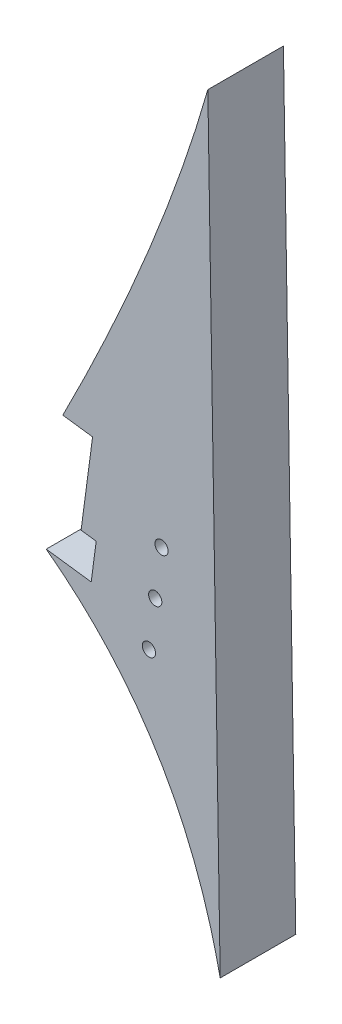
ISO-10303-21;
HEADER;
FILE_DESCRIPTION(('STEP AP214'),'2;1');
FILE_NAME('part.step','',(''),(''),'','','');
FILE_SCHEMA(('AUTOMOTIVE_DESIGN { 1 0 10303 214 1 1 1 1 }'));
ENDSEC;
DATA;
#1=APPLICATION_CONTEXT('core data for automotive mechanical design processes');
#2=APPLICATION_PROTOCOL_DEFINITION('international standard','automotive_design',2000,#1);
#3=PRODUCT_CONTEXT('',#1,'mechanical');
#4=PRODUCT('Part','Part','',(#3));
#5=PRODUCT_RELATED_PRODUCT_CATEGORY('part','',(#4));
#6=PRODUCT_DEFINITION_FORMATION('','',#4);
#7=PRODUCT_DEFINITION_CONTEXT('part definition',#1,'design');
#8=PRODUCT_DEFINITION('design','',#6,#7);
#9=PRODUCT_DEFINITION_SHAPE('','',#8);
#10=(LENGTH_UNIT() NAMED_UNIT(*) SI_UNIT(.MILLI.,.METRE.));
#11=(NAMED_UNIT(*) PLANE_ANGLE_UNIT() SI_UNIT($,.RADIAN.));
#12=(NAMED_UNIT(*) SI_UNIT($,.STERADIAN.) SOLID_ANGLE_UNIT());
#13=UNCERTAINTY_MEASURE_WITH_UNIT(LENGTH_MEASURE(1.E-05),#10,'distance_accuracy_value','');
#14=(GEOMETRIC_REPRESENTATION_CONTEXT(3) GLOBAL_UNCERTAINTY_ASSIGNED_CONTEXT((#13)) GLOBAL_UNIT_ASSIGNED_CONTEXT((#10,
#11,#12)) REPRESENTATION_CONTEXT('',''));
#15=CARTESIAN_POINT('',(0.,0.,0.));
#16=DIRECTION('',(0.,0.,1.));
#17=DIRECTION('',(1.,0.,0.));
#18=AXIS2_PLACEMENT_3D('',#15,#16,#17);
#19=CARTESIAN_POINT('',(273.434767302731,-422.936084160786,20.));
#20=DIRECTION('',(0.131604534920493,0.991302298185756,0.));
#21=DIRECTION('',(-0.991302298185756,0.131604534920493,0.));
#22=AXIS2_PLACEMENT_3D('',#19,#20,#21);
#23=PLANE('',#22);
#24=DIRECTION('',(0.991302298185755,-0.131604534920493,0.));
#25=VECTOR('',#24,1.);
#26=CARTESIAN_POINT('',(273.434767302731,-422.936084160786,0.));
#27=LINE('',#26,#25);
#28=CARTESIAN_POINT('',(265.552888050043,-421.889691899568,0.));
#29=VERTEX_POINT('',#28);
#30=CARTESIAN_POINT('',(273.434767302731,-422.936084160786,0.));
#31=VERTEX_POINT('',#30);
#32=EDGE_CURVE('E135',#29,#31,#27,.T.);
#33=ORIENTED_EDGE('',*,*,#32,.T.);
#34=DIRECTION('',(0.,0.,-1.));
#35=VECTOR('',#34,1.);
#36=CARTESIAN_POINT('',(273.434767302731,-422.936084160786,20.));
#37=LINE('',#36,#35);
#38=CARTESIAN_POINT('',(273.434767302731,-422.936084160786,20.));
#39=VERTEX_POINT('',#38);
#40=EDGE_CURVE('E11',#39,#31,#37,.T.);
#41=ORIENTED_EDGE('',*,*,#40,.F.);
#42=DIRECTION('',(0.991302298185755,-0.131604534920493,0.));
#43=VECTOR('',#42,1.);
#44=CARTESIAN_POINT('',(273.434767302731,-422.936084160786,20.));
#45=LINE('',#44,#43);
#46=CARTESIAN_POINT('',(265.552888050043,-421.889691899568,20.));
#47=VERTEX_POINT('',#46);
#48=EDGE_CURVE('E199',#47,#39,#45,.T.);
#49=ORIENTED_EDGE('',*,*,#48,.F.);
#50=DIRECTION('',(0.,0.,-1.));
#51=VECTOR('',#50,1.);
#52=CARTESIAN_POINT('',(265.552888050043,-421.889691899568,20.));
#53=LINE('',#52,#51);
#54=EDGE_CURVE('E125',#47,#29,#53,.T.);
#55=ORIENTED_EDGE('',*,*,#54,.T.);
#56=EDGE_LOOP('',(#33,#41,#49,#55));
#57=FACE_BOUND('',#56,.T.);
#58=ADVANCED_FACE('F33',(#57),#23,.F.);
#59=CARTESIAN_POINT('',(273.434767302731,-422.936084160786,20.));
#60=DIRECTION('',(0.991302298185739,-0.131604534920616,0.));
#61=DIRECTION('',(0.131604534920616,0.991302298185739,0.));
#62=AXIS2_PLACEMENT_3D('',#59,#60,#61);
#63=PLANE('',#62);
#64=DIRECTION('',(-0.131604534920616,-0.991302298185739,0.));
#65=VECTOR('',#64,1.);
#66=CARTESIAN_POINT('',(273.434767302731,-422.936084160786,0.));
#67=LINE('',#66,#65);
#68=CARTESIAN_POINT('',(270.394702546065,-445.835167248877,0.));
#69=VERTEX_POINT('',#68);
#70=EDGE_CURVE('E168',#31,#69,#67,.T.);
#71=ORIENTED_EDGE('',*,*,#70,.T.);
#72=DIRECTION('',(0.,0.,-1.));
#73=VECTOR('',#72,1.);
#74=CARTESIAN_POINT('',(270.394702546065,-445.835167248877,20.));
#75=LINE('',#74,#73);
#76=CARTESIAN_POINT('',(270.394702546065,-445.835167248877,20.));
#77=VERTEX_POINT('',#76);
#78=EDGE_CURVE('E41',#77,#69,#75,.T.);
#79=ORIENTED_EDGE('',*,*,#78,.F.);
#80=DIRECTION('',(-0.131604534920616,-0.991302298185739,0.));
#81=VECTOR('',#80,1.);
#82=CARTESIAN_POINT('',(273.434767302731,-422.936084160786,20.));
#83=LINE('',#82,#81);
#84=EDGE_CURVE('E91',#39,#77,#83,.T.);
#85=ORIENTED_EDGE('',*,*,#84,.F.);
#86=ORIENTED_EDGE('',*,*,#40,.T.);
#87=EDGE_LOOP('',(#71,#79,#85,#86));
#88=FACE_BOUND('',#87,.T.);
#89=ADVANCED_FACE('F161',(#88),#63,.F.);
#90=CARTESIAN_POINT('',(270.394702546065,-445.835167248877,20.));
#91=DIRECTION('',(0.131604534920474,0.991302298185758,0.));
#92=DIRECTION('',(-0.991302298185758,0.131604534920474,0.));
#93=AXIS2_PLACEMENT_3D('',#90,#91,#92);
#94=PLANE('',#93);
#95=DIRECTION('',(0.991302298185758,-0.131604534920474,0.));
#96=VECTOR('',#95,1.);
#97=CARTESIAN_POINT('',(270.394702546065,-445.835167248877,0.));
#98=LINE('',#97,#96);
#99=CARTESIAN_POINT('',(274.394702546067,-446.366204189521,0.));
#100=VERTEX_POINT('',#99);
#101=EDGE_CURVE('E176',#69,#100,#98,.T.);
#102=ORIENTED_EDGE('',*,*,#101,.T.);
#103=DIRECTION('',(0.,0.,-1.));
#104=VECTOR('',#103,1.);
#105=CARTESIAN_POINT('',(274.394702546067,-446.366204189521,20.));
#106=LINE('',#105,#104);
#107=CARTESIAN_POINT('',(274.394702546067,-446.366204189521,20.));
#108=VERTEX_POINT('',#107);
#109=EDGE_CURVE('E180',#108,#100,#106,.T.);
#110=ORIENTED_EDGE('',*,*,#109,.F.);
#111=DIRECTION('',(0.991302298185758,-0.131604534920474,0.));
#112=VECTOR('',#111,1.);
#113=CARTESIAN_POINT('',(270.394702546065,-445.835167248877,20.));
#114=LINE('',#113,#112);
#115=EDGE_CURVE('E179',#77,#108,#114,.T.);
#116=ORIENTED_EDGE('',*,*,#115,.F.);
#117=ORIENTED_EDGE('',*,*,#78,.T.);
#118=EDGE_LOOP('',(#102,#110,#116,#117));
#119=FACE_BOUND('',#118,.T.);
#120=ADVANCED_FACE('F158',(#119),#94,.F.);
#121=CARTESIAN_POINT('',(274.394702546067,-446.366204189521,20.));
#122=DIRECTION('',(0.991302298185756,-0.131604534920488,0.));
#123=DIRECTION('',(0.131604534920488,0.991302298185756,0.));
#124=AXIS2_PLACEMENT_3D('',#121,#122,#123);
#125=PLANE('',#124);
#126=DIRECTION('',(-0.131604534920488,-0.991302298185756,0.));
#127=VECTOR('',#126,1.);
#128=CARTESIAN_POINT('',(274.394702546067,-446.366204189521,0.));
#129=LINE('',#128,#127);
#130=CARTESIAN_POINT('',(273.067110194457,-456.366204189521,0.));
#131=VERTEX_POINT('',#130);
#132=EDGE_CURVE('E183',#100,#131,#129,.T.);
#133=ORIENTED_EDGE('',*,*,#132,.T.);
#134=DIRECTION('',(0.,0.,-1.));
#135=VECTOR('',#134,1.);
#136=CARTESIAN_POINT('',(273.067110194457,-456.366204189521,20.));
#137=LINE('',#136,#135);
#138=CARTESIAN_POINT('',(273.067110194457,-456.366204189521,20.));
#139=VERTEX_POINT('',#138);
#140=EDGE_CURVE('E206',#139,#131,#137,.T.);
#141=ORIENTED_EDGE('',*,*,#140,.F.);
#142=DIRECTION('',(-0.131604534920488,-0.991302298185756,0.));
#143=VECTOR('',#142,1.);
#144=CARTESIAN_POINT('',(274.394702546067,-446.366204189521,20.));
#145=LINE('',#144,#143);
#146=EDGE_CURVE('E211',#108,#139,#145,.T.);
#147=ORIENTED_EDGE('',*,*,#146,.F.);
#148=ORIENTED_EDGE('',*,*,#109,.T.);
#149=EDGE_LOOP('',(#133,#141,#147,#148));
#150=FACE_BOUND('',#149,.T.);
#151=ADVANCED_FACE('F154',(#150),#125,.F.);
#152=CARTESIAN_POINT('',(273.067110194457,-456.366204189521,20.));
#153=DIRECTION('',(-0.131604534920499,-0.991302298185755,0.));
#154=DIRECTION('',(0.991302298185755,-0.131604534920499,0.));
#155=AXIS2_PLACEMENT_3D('',#152,#153,#154);
#156=PLANE('',#155);
#157=DIRECTION('',(-0.991302298185755,0.131604534920499,0.));
#158=VECTOR('',#157,1.);
#159=CARTESIAN_POINT('',(273.067110194457,-456.366204189521,0.));
#160=LINE('',#159,#158);
#161=CARTESIAN_POINT('',(261.171482616228,-454.786949770475,0.));
#162=VERTEX_POINT('',#161);
#163=EDGE_CURVE('E185',#131,#162,#160,.T.);
#164=ORIENTED_EDGE('',*,*,#163,.T.);
#165=DIRECTION('',(0.,0.,-1.));
#166=VECTOR('',#165,1.);
#167=CARTESIAN_POINT('',(261.171482616228,-454.786949770475,20.));
#168=LINE('',#167,#166);
#169=CARTESIAN_POINT('',(261.171482616228,-454.786949770475,20.));
#170=VERTEX_POINT('',#169);
#171=EDGE_CURVE('E120',#170,#162,#168,.T.);
#172=ORIENTED_EDGE('',*,*,#171,.F.);
#173=DIRECTION('',(-0.991302298185755,0.131604534920499,0.));
#174=VECTOR('',#173,1.);
#175=CARTESIAN_POINT('',(273.067110194457,-456.366204189521,20.));
#176=LINE('',#175,#174);
#177=EDGE_CURVE('E110',#139,#170,#176,.T.);
#178=ORIENTED_EDGE('',*,*,#177,.F.);
#179=ORIENTED_EDGE('',*,*,#140,.T.);
#180=EDGE_LOOP('',(#164,#172,#178,#179));
#181=FACE_BOUND('',#180,.T.);
#182=ADVANCED_FACE('F151',(#181),#156,.F.);
#183=CARTESIAN_POINT('',(261.171482616228,-454.786949770475,20.));
#184=CARTESIAN_POINT('',(296.963881997729,-481.467411972177,20.));
#185=CARTESIAN_POINT('',(307.211379583994,-530.076645966641,20.));
#186=B_SPLINE_CURVE_WITH_KNOTS('',2,(#183,#184,#185),.UNSPECIFIED.,.F.,.F.,(3,3),(0.,1.),.UNSPECIFIED.);
#187=DIRECTION('',(0.,0.,-1.));
#188=VECTOR('',#187,1.);
#189=SURFACE_OF_LINEAR_EXTRUSION('',#186,#188);
#190=CARTESIAN_POINT('',(261.171482616228,-454.786949770475,0.));
#191=CARTESIAN_POINT('',(296.963881997729,-481.467411972177,0.));
#192=CARTESIAN_POINT('',(307.211379583994,-530.076645966641,0.));
#193=B_SPLINE_CURVE_WITH_KNOTS('',2,(#190,#191,#192),.UNSPECIFIED.,.F.,.F.,(3,3),(0.,1.),.UNSPECIFIED.);
#194=CARTESIAN_POINT('',(307.211379583994,-530.076645966641,0.));
#195=VERTEX_POINT('',#194);
#196=EDGE_CURVE('E119',#162,#195,#193,.T.);
#197=ORIENTED_EDGE('',*,*,#196,.T.);
#198=DIRECTION('',(0.,0.,-1.));
#199=VECTOR('',#198,1.);
#200=CARTESIAN_POINT('',(307.211379583994,-530.076645966641,20.));
#201=LINE('',#200,#199);
#202=CARTESIAN_POINT('',(307.211379583994,-530.076645966641,20.));
#203=VERTEX_POINT('',#202);
#204=EDGE_CURVE('E116',#203,#195,#201,.T.);
#205=ORIENTED_EDGE('',*,*,#204,.F.);
#206=EDGE_CURVE('E104',#170,#203,#186,.T.);
#207=ORIENTED_EDGE('',*,*,#206,.F.);
#208=ORIENTED_EDGE('',*,*,#171,.T.);
#209=EDGE_LOOP('',(#197,#205,#207,#208));
#210=FACE_BOUND('',#209,.T.);
#211=ADVANCED_FACE('F117',(#210),#189,.F.);
#212=CARTESIAN_POINT('',(304.794080931401,-380.481047826027,20.));
#213=DIRECTION('',(-0.999869470715799,-0.0161567797072358,0.));
#214=DIRECTION('',(0.0161567797072358,-0.999869470715799,0.));
#215=AXIS2_PLACEMENT_3D('',#212,#213,#214);
#216=PLANE('',#215);
#217=DIRECTION('',(-0.0161567797072358,0.999869470715799,0.));
#218=VECTOR('',#217,1.);
#219=CARTESIAN_POINT('',(304.794080931401,-380.481047826027,0.));
#220=LINE('',#219,#218);
#221=CARTESIAN_POINT('',(303.947271008408,-328.075840548202,0.));
#222=VERTEX_POINT('',#221);
#223=EDGE_CURVE('E77',#195,#222,#220,.T.);
#224=ORIENTED_EDGE('',*,*,#223,.T.);
#225=DIRECTION('',(0.,0.,-1.));
#226=VECTOR('',#225,1.);
#227=CARTESIAN_POINT('',(303.947271008408,-328.075840548202,20.));
#228=LINE('',#227,#226);
#229=CARTESIAN_POINT('',(303.947271008408,-328.075840548202,20.));
#230=VERTEX_POINT('',#229);
#231=EDGE_CURVE('E121',#230,#222,#228,.T.);
#232=ORIENTED_EDGE('',*,*,#231,.F.);
#233=DIRECTION('',(-0.0161567797072361,0.999869470715799,0.));
#234=VECTOR('',#233,1.);
#235=CARTESIAN_POINT('',(306.5276142249,-487.76152376536,20.));
#236=LINE('',#235,#234);
#237=EDGE_CURVE('E108',#203,#230,#236,.T.);
#238=ORIENTED_EDGE('',*,*,#237,.F.);
#239=ORIENTED_EDGE('',*,*,#204,.T.);
#240=EDGE_LOOP('',(#224,#232,#238,#239));
#241=FACE_BOUND('',#240,.T.);
#242=ADVANCED_FACE('F123',(#241),#216,.F.);
#243=CARTESIAN_POINT('',(303.947271008408,-328.075840548202,20.));
#244=CARTESIAN_POINT('',(291.93823328982,-370.199418031665,20.));
#245=CARTESIAN_POINT('',(265.552888050043,-421.889691899568,20.));
#246=B_SPLINE_CURVE_WITH_KNOTS('',2,(#243,#244,#245),.UNSPECIFIED.,.F.,.F.,(3,3),(0.,1.),.UNSPECIFIED.);
#247=DIRECTION('',(0.,0.,-1.));
#248=VECTOR('',#247,1.);
#249=SURFACE_OF_LINEAR_EXTRUSION('',#246,#248);
#250=CARTESIAN_POINT('',(303.947271008408,-328.075840548202,0.));
#251=CARTESIAN_POINT('',(291.93823328982,-370.199418031665,0.));
#252=CARTESIAN_POINT('',(265.552888050043,-421.889691899568,0.));
#253=B_SPLINE_CURVE_WITH_KNOTS('',2,(#250,#251,#252),.UNSPECIFIED.,.F.,.F.,(3,3),(0.,1.),.UNSPECIFIED.);
#254=EDGE_CURVE('E83',#222,#29,#253,.T.);
#255=ORIENTED_EDGE('',*,*,#254,.T.);
#256=ORIENTED_EDGE('',*,*,#54,.F.);
#257=EDGE_CURVE('E49',#230,#47,#246,.T.);
#258=ORIENTED_EDGE('',*,*,#257,.F.);
#259=ORIENTED_EDGE('',*,*,#231,.T.);
#260=EDGE_LOOP('',(#255,#256,#258,#259));
#261=FACE_BOUND('',#260,.T.);
#262=ADVANCED_FACE('F141',(#261),#249,.F.);
#263=CARTESIAN_POINT('',(288.344156409523,-372.591092127775,20.));
#264=DIRECTION('',(0.,0.,1.));
#265=DIRECTION('',(1.,0.,0.));
#266=AXIS2_PLACEMENT_3D('',#263,#264,#265);
#267=PLANE('',#266);
#268=CARTESIAN_POINT('',(288.352935211609,-464.179893051408,20.));
#269=DIRECTION('',(0.,0.,1.));
#270=DIRECTION('',(1.,0.,0.));
#271=AXIS2_PLACEMENT_3D('',#268,#269,#270);
#272=CIRCLE('',#271,1.74999999999998);
#273=CARTESIAN_POINT('',(290.102935211609,-464.179893051408,20.));
#274=VERTEX_POINT('',#273);
#275=EDGE_CURVE('E229',#274,#274,#272,.T.);
#276=ORIENTED_EDGE('',*,*,#275,.F.);
#277=EDGE_LOOP('',(#276));
#278=FACE_BOUND('',#277,.T.);
#279=CARTESIAN_POINT('',(290.016681940702,-451.647832836733,20.));
#280=DIRECTION('',(0.,0.,1.));
#281=DIRECTION('',(1.,0.,0.));
#282=AXIS2_PLACEMENT_3D('',#279,#280,#281);
#283=CIRCLE('',#282,1.74999999999998);
#284=CARTESIAN_POINT('',(291.766681940702,-451.647832836733,20.));
#285=VERTEX_POINT('',#284);
#286=EDGE_CURVE('E223',#285,#285,#283,.T.);
#287=ORIENTED_EDGE('',*,*,#286,.F.);
#288=EDGE_LOOP('',(#287));
#289=FACE_BOUND('',#288,.T.);
#290=CARTESIAN_POINT('',(291.680428669797,-439.115772622058,20.));
#291=DIRECTION('',(0.,0.,1.));
#292=DIRECTION('',(1.,0.,0.));
#293=AXIS2_PLACEMENT_3D('',#290,#291,#292);
#294=CIRCLE('',#293,1.74999999999777);
#295=CARTESIAN_POINT('',(293.430428669794,-439.115772622058,20.));
#296=VERTEX_POINT('',#295);
#297=EDGE_CURVE('E217',#296,#296,#294,.T.);
#298=ORIENTED_EDGE('',*,*,#297,.F.);
#299=EDGE_LOOP('',(#298));
#300=FACE_BOUND('',#299,.T.);
#301=ORIENTED_EDGE('',*,*,#48,.T.);
#302=ORIENTED_EDGE('',*,*,#84,.T.);
#303=ORIENTED_EDGE('',*,*,#115,.T.);
#304=ORIENTED_EDGE('',*,*,#146,.T.);
#305=ORIENTED_EDGE('',*,*,#177,.T.);
#306=ORIENTED_EDGE('',*,*,#206,.T.);
#307=ORIENTED_EDGE('',*,*,#237,.T.);
#308=ORIENTED_EDGE('',*,*,#257,.T.);
#309=EDGE_LOOP('',(#301,#302,#303,#304,#305,#306,#307,#308));
#310=FACE_BOUND('',#309,.T.);
#311=ADVANCED_FACE('F106',(#278,#289,#300,#310),#267,.T.);
#312=CARTESIAN_POINT('',(288.344156409523,-372.591092127775,0.));
#313=DIRECTION('',(0.,0.,1.));
#314=DIRECTION('',(1.,0.,0.));
#315=AXIS2_PLACEMENT_3D('',#312,#313,#314);
#316=PLANE('',#315);
#317=CARTESIAN_POINT('',(288.352935211609,-464.179893051408,0.));
#318=DIRECTION('',(0.,0.,1.));
#319=DIRECTION('',(1.,0.,0.));
#320=AXIS2_PLACEMENT_3D('',#317,#318,#319);
#321=CIRCLE('',#320,1.74999999999998);
#322=CARTESIAN_POINT('',(290.102935211609,-464.179893051408,0.));
#323=VERTEX_POINT('',#322);
#324=EDGE_CURVE('E232',#323,#323,#321,.T.);
#325=ORIENTED_EDGE('',*,*,#324,.T.);
#326=EDGE_LOOP('',(#325));
#327=FACE_BOUND('',#326,.T.);
#328=CARTESIAN_POINT('',(290.016681940702,-451.647832836733,0.));
#329=DIRECTION('',(0.,0.,1.));
#330=DIRECTION('',(1.,0.,0.));
#331=AXIS2_PLACEMENT_3D('',#328,#329,#330);
#332=CIRCLE('',#331,1.74999999999998);
#333=CARTESIAN_POINT('',(291.766681940702,-451.647832836733,0.));
#334=VERTEX_POINT('',#333);
#335=EDGE_CURVE('E226',#334,#334,#332,.T.);
#336=ORIENTED_EDGE('',*,*,#335,.T.);
#337=EDGE_LOOP('',(#336));
#338=FACE_BOUND('',#337,.T.);
#339=CARTESIAN_POINT('',(291.680428669797,-439.115772622058,0.));
#340=DIRECTION('',(0.,0.,1.));
#341=DIRECTION('',(1.,0.,0.));
#342=AXIS2_PLACEMENT_3D('',#339,#340,#341);
#343=CIRCLE('',#342,1.74999999999777);
#344=CARTESIAN_POINT('',(293.430428669794,-439.115772622058,0.));
#345=VERTEX_POINT('',#344);
#346=EDGE_CURVE('E220',#345,#345,#343,.T.);
#347=ORIENTED_EDGE('',*,*,#346,.T.);
#348=EDGE_LOOP('',(#347));
#349=FACE_BOUND('',#348,.T.);
#350=ORIENTED_EDGE('',*,*,#32,.F.);
#351=ORIENTED_EDGE('',*,*,#254,.F.);
#352=ORIENTED_EDGE('',*,*,#223,.F.);
#353=ORIENTED_EDGE('',*,*,#196,.F.);
#354=ORIENTED_EDGE('',*,*,#163,.F.);
#355=ORIENTED_EDGE('',*,*,#132,.F.);
#356=ORIENTED_EDGE('',*,*,#101,.F.);
#357=ORIENTED_EDGE('',*,*,#70,.F.);
#358=EDGE_LOOP('',(#350,#351,#352,#353,#354,#355,#356,#357));
#359=FACE_BOUND('',#358,.T.);
#360=ADVANCED_FACE('F145',(#327,#338,#349,#359),#316,.F.);
#361=CARTESIAN_POINT('',(291.680428669797,-439.115772622058,0.));
#362=DIRECTION('',(0.,0.,1.));
#363=DIRECTION('',(1.,0.,0.));
#364=AXIS2_PLACEMENT_3D('',#361,#362,#363);
#365=CYLINDRICAL_SURFACE('',#364,1.74999999999777);
#366=ORIENTED_EDGE('',*,*,#346,.F.);
#367=EDGE_LOOP('',(#366));
#368=FACE_BOUND('',#367,.T.);
#369=ORIENTED_EDGE('',*,*,#297,.T.);
#370=EDGE_LOOP('',(#369));
#371=FACE_BOUND('',#370,.T.);
#372=ADVANCED_FACE('F252',(#368,#371),#365,.F.);
#373=CARTESIAN_POINT('',(290.016681940702,-451.647832836733,0.));
#374=DIRECTION('',(0.,0.,1.));
#375=DIRECTION('',(1.,0.,0.));
#376=AXIS2_PLACEMENT_3D('',#373,#374,#375);
#377=CYLINDRICAL_SURFACE('',#376,1.74999999999998);
#378=ORIENTED_EDGE('',*,*,#335,.F.);
#379=EDGE_LOOP('',(#378));
#380=FACE_BOUND('',#379,.T.);
#381=ORIENTED_EDGE('',*,*,#286,.T.);
#382=EDGE_LOOP('',(#381));
#383=FACE_BOUND('',#382,.T.);
#384=ADVANCED_FACE('F242',(#380,#383),#377,.F.);
#385=CARTESIAN_POINT('',(288.352935211609,-464.179893051408,0.));
#386=DIRECTION('',(0.,0.,1.));
#387=DIRECTION('',(1.,0.,0.));
#388=AXIS2_PLACEMENT_3D('',#385,#386,#387);
#389=CYLINDRICAL_SURFACE('',#388,1.74999999999998);
#390=ORIENTED_EDGE('',*,*,#324,.F.);
#391=EDGE_LOOP('',(#390));
#392=FACE_BOUND('',#391,.T.);
#393=ORIENTED_EDGE('',*,*,#275,.T.);
#394=EDGE_LOOP('',(#393));
#395=FACE_BOUND('',#394,.T.);
#396=ADVANCED_FACE('F239',(#392,#395),#389,.F.);
#397=CLOSED_SHELL('',(#58,#89,#120,#151,#182,#211,#242,#262,#311,#360,#372,#384,#396));
#398=MANIFOLD_SOLID_BREP('B2',#397);
#399=ADVANCED_BREP_SHAPE_REPRESENTATION('',(#18,#398),#14);
#400=SHAPE_DEFINITION_REPRESENTATION(#9,#399);
ENDSEC;
END-ISO-10303-21;
